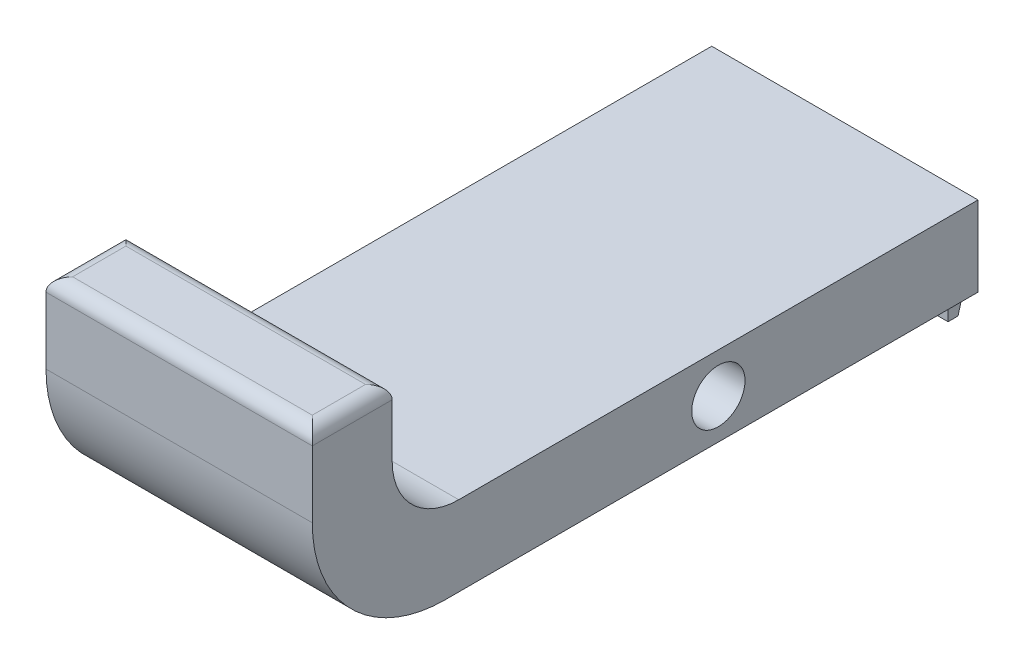
ISO-10303-21;
HEADER;
FILE_DESCRIPTION(('STEP AP214'),'2;1');
FILE_NAME('part.step','',(''),(''),'','','');
FILE_SCHEMA(('AUTOMOTIVE_DESIGN { 1 0 10303 214 1 1 1 1 }'));
ENDSEC;
DATA;
#1=APPLICATION_CONTEXT('core data for automotive mechanical design processes');
#2=APPLICATION_PROTOCOL_DEFINITION('international standard','automotive_design',2000,#1);
#3=PRODUCT_CONTEXT('',#1,'mechanical');
#4=PRODUCT('Part','Part','',(#3));
#5=PRODUCT_RELATED_PRODUCT_CATEGORY('part','',(#4));
#6=PRODUCT_DEFINITION_FORMATION('','',#4);
#7=PRODUCT_DEFINITION_CONTEXT('part definition',#1,'design');
#8=PRODUCT_DEFINITION('design','',#6,#7);
#9=PRODUCT_DEFINITION_SHAPE('','',#8);
#10=(LENGTH_UNIT() NAMED_UNIT(*) SI_UNIT(.MILLI.,.METRE.));
#11=(NAMED_UNIT(*) PLANE_ANGLE_UNIT() SI_UNIT($,.RADIAN.));
#12=(NAMED_UNIT(*) SI_UNIT($,.STERADIAN.) SOLID_ANGLE_UNIT());
#13=UNCERTAINTY_MEASURE_WITH_UNIT(LENGTH_MEASURE(1.E-05),#10,'distance_accuracy_value','');
#14=(GEOMETRIC_REPRESENTATION_CONTEXT(3) GLOBAL_UNCERTAINTY_ASSIGNED_CONTEXT((#13)) GLOBAL_UNIT_ASSIGNED_CONTEXT((#10,
#11,#12)) REPRESENTATION_CONTEXT('',''));
#15=CARTESIAN_POINT('',(0.,0.,0.));
#16=DIRECTION('',(0.,0.,1.));
#17=DIRECTION('',(1.,0.,0.));
#18=AXIS2_PLACEMENT_3D('',#15,#16,#17);
#19=CARTESIAN_POINT('',(-10.,-3.,50.));
#20=DIRECTION('',(0.,1.,0.));
#21=DIRECTION('',(0.,0.,1.));
#22=AXIS2_PLACEMENT_3D('',#19,#20,#21);
#23=PLANE('',#22);
#24=DIRECTION('',(0.,0.,-1.));
#25=VECTOR('',#24,1.);
#26=CARTESIAN_POINT('',(10.,-3.,50.));
#27=LINE('',#26,#25);
#28=CARTESIAN_POINT('',(10.,-3.,40.));
#29=VERTEX_POINT('',#28);
#30=CARTESIAN_POINT('',(10.,-3.,0.));
#31=VERTEX_POINT('',#30);
#32=EDGE_CURVE('E197',#29,#31,#27,.T.);
#33=ORIENTED_EDGE('',*,*,#32,.F.);
#34=DIRECTION('',(1.,0.,0.));
#35=VECTOR('',#34,1.);
#36=CARTESIAN_POINT('',(-10.,-3.,40.));
#37=LINE('',#36,#35);
#38=CARTESIAN_POINT('',(-10.,-3.,40.));
#39=VERTEX_POINT('',#38);
#40=EDGE_CURVE('E204',#29,#39,#37,.F.);
#41=ORIENTED_EDGE('',*,*,#40,.T.);
#42=DIRECTION('',(0.,0.,-1.));
#43=VECTOR('',#42,1.);
#44=CARTESIAN_POINT('',(-10.,-3.,50.));
#45=LINE('',#44,#43);
#46=CARTESIAN_POINT('',(-10.,-3.,0.));
#47=VERTEX_POINT('',#46);
#48=EDGE_CURVE('E180',#39,#47,#45,.T.);
#49=ORIENTED_EDGE('',*,*,#48,.T.);
#50=DIRECTION('',(1.,0.,0.));
#51=VECTOR('',#50,1.);
#52=CARTESIAN_POINT('',(-10.,-3.,0.));
#53=LINE('',#52,#51);
#54=CARTESIAN_POINT('',(-9.,-3.,0.));
#55=VERTEX_POINT('',#54);
#56=EDGE_CURVE('E181',#47,#55,#53,.T.);
#57=ORIENTED_EDGE('',*,*,#56,.T.);
#58=DIRECTION('',(0.,0.,1.));
#59=VECTOR('',#58,1.);
#60=CARTESIAN_POINT('',(-9.,-3.,1.25));
#61=LINE('',#60,#59);
#62=CARTESIAN_POINT('',(-9.,-3.,1.25));
#63=VERTEX_POINT('',#62);
#64=EDGE_CURVE('E165',#55,#63,#61,.T.);
#65=ORIENTED_EDGE('',*,*,#64,.T.);
#66=DIRECTION('',(1.,0.,0.));
#67=VECTOR('',#66,1.);
#68=CARTESIAN_POINT('',(-9.,-3.,1.25));
#69=LINE('',#68,#67);
#70=CARTESIAN_POINT('',(9.,-3.,1.25));
#71=VERTEX_POINT('',#70);
#72=EDGE_CURVE('E144',#63,#71,#69,.T.);
#73=ORIENTED_EDGE('',*,*,#72,.T.);
#74=DIRECTION('',(0.,0.,1.));
#75=VECTOR('',#74,1.);
#76=CARTESIAN_POINT('',(9.,-3.,1.25));
#77=LINE('',#76,#75);
#78=CARTESIAN_POINT('',(9.,-3.,0.));
#79=VERTEX_POINT('',#78);
#80=EDGE_CURVE('E151',#79,#71,#77,.T.);
#81=ORIENTED_EDGE('',*,*,#80,.F.);
#82=EDGE_CURVE('E184',#79,#31,#53,.T.);
#83=ORIENTED_EDGE('',*,*,#82,.T.);
#84=EDGE_LOOP('',(#33,#41,#49,#57,#65,#73,#81,#83));
#85=FACE_BOUND('',#84,.T.);
#86=ADVANCED_FACE('F37',(#85),#23,.F.);
#87=CARTESIAN_POINT('',(10.,3.,50.));
#88=DIRECTION('',(1.,0.,0.));
#89=DIRECTION('',(0.,0.,-1.));
#90=AXIS2_PLACEMENT_3D('',#87,#88,#89);
#91=PLANE('',#90);
#92=CARTESIAN_POINT('',(10.,0.,19.5));
#93=DIRECTION('',(1.,0.,0.));
#94=DIRECTION('',(0.,0.,-1.));
#95=AXIS2_PLACEMENT_3D('',#92,#93,#94);
#96=CIRCLE('',#95,2.);
#97=CARTESIAN_POINT('',(10.,0.,17.5));
#98=VERTEX_POINT('',#97);
#99=EDGE_CURVE('E250',#98,#98,#96,.T.);
#100=ORIENTED_EDGE('',*,*,#99,.F.);
#101=EDGE_LOOP('',(#100));
#102=FACE_BOUND('',#101,.T.);
#103=DIRECTION('',(0.,-1.,0.));
#104=VECTOR('',#103,1.);
#105=CARTESIAN_POINT('',(10.,13.,44.));
#106=LINE('',#105,#104);
#107=CARTESIAN_POINT('',(10.,12.,44.));
#108=VERTEX_POINT('',#107);
#109=CARTESIAN_POINT('',(10.,8.,44.));
#110=VERTEX_POINT('',#109);
#111=EDGE_CURVE('E247',#108,#110,#106,.T.);
#112=ORIENTED_EDGE('',*,*,#111,.F.);
#113=DIRECTION('',(0.,0.,-1.));
#114=VECTOR('',#113,1.);
#115=CARTESIAN_POINT('',(10.,12.,50.));
#116=LINE('',#115,#114);
#117=CARTESIAN_POINT('',(10.,12.,50.));
#118=VERTEX_POINT('',#117);
#119=EDGE_CURVE('E11',#108,#118,#116,.F.);
#120=ORIENTED_EDGE('',*,*,#119,.T.);
#121=DIRECTION('',(0.,-1.,0.));
#122=VECTOR('',#121,1.);
#123=CARTESIAN_POINT('',(10.,3.,50.));
#124=LINE('',#123,#122);
#125=CARTESIAN_POINT('',(10.,7.,50.));
#126=VERTEX_POINT('',#125);
#127=EDGE_CURVE('E175',#118,#126,#124,.T.);
#128=ORIENTED_EDGE('',*,*,#127,.T.);
#129=CARTESIAN_POINT('',(10.,7.,40.));
#130=DIRECTION('',(1.,0.,0.));
#131=DIRECTION('',(0.,0.,-1.));
#132=AXIS2_PLACEMENT_3D('',#129,#130,#131);
#133=CIRCLE('',#132,10.);
#134=EDGE_CURVE('E202',#126,#29,#133,.T.);
#135=ORIENTED_EDGE('',*,*,#134,.T.);
#136=ORIENTED_EDGE('',*,*,#32,.T.);
#137=DIRECTION('',(0.,-1.,0.));
#138=VECTOR('',#137,1.);
#139=CARTESIAN_POINT('',(10.,3.,0.));
#140=LINE('',#139,#138);
#141=CARTESIAN_POINT('',(10.,3.,0.));
#142=VERTEX_POINT('',#141);
#143=EDGE_CURVE('E183',#142,#31,#140,.T.);
#144=ORIENTED_EDGE('',*,*,#143,.F.);
#145=DIRECTION('',(0.,0.,-1.));
#146=VECTOR('',#145,1.);
#147=CARTESIAN_POINT('',(10.,3.,50.));
#148=LINE('',#147,#146);
#149=CARTESIAN_POINT('',(10.,3.,39.));
#150=VERTEX_POINT('',#149);
#151=EDGE_CURVE('E195',#150,#142,#148,.T.);
#152=ORIENTED_EDGE('',*,*,#151,.F.);
#153=CARTESIAN_POINT('',(10.,8.,39.));
#154=DIRECTION('',(1.,0.,0.));
#155=DIRECTION('',(0.,0.,-1.));
#156=AXIS2_PLACEMENT_3D('',#153,#154,#155);
#157=CIRCLE('',#156,5.);
#158=EDGE_CURVE('E216',#150,#110,#157,.F.);
#159=ORIENTED_EDGE('',*,*,#158,.T.);
#160=EDGE_LOOP('',(#112,#120,#128,#135,#136,#144,#152,#159));
#161=FACE_BOUND('',#160,.T.);
#162=ADVANCED_FACE('F289',(#102,#161),#91,.T.);
#163=CARTESIAN_POINT('',(-10.,3.,50.));
#164=DIRECTION('',(0.,1.,0.));
#165=DIRECTION('',(0.,0.,1.));
#166=AXIS2_PLACEMENT_3D('',#163,#164,#165);
#167=PLANE('',#166);
#168=DIRECTION('',(0.,0.,-1.));
#169=VECTOR('',#168,1.);
#170=CARTESIAN_POINT('',(-10.,3.,50.));
#171=LINE('',#170,#169);
#172=CARTESIAN_POINT('',(-10.,3.,39.));
#173=VERTEX_POINT('',#172);
#174=CARTESIAN_POINT('',(-10.,3.,0.));
#175=VERTEX_POINT('',#174);
#176=EDGE_CURVE('E193',#173,#175,#171,.T.);
#177=ORIENTED_EDGE('',*,*,#176,.F.);
#178=DIRECTION('',(-1.,0.,0.));
#179=VECTOR('',#178,1.);
#180=CARTESIAN_POINT('',(-10.,3.,39.));
#181=LINE('',#180,#179);
#182=EDGE_CURVE('E212',#173,#150,#181,.F.);
#183=ORIENTED_EDGE('',*,*,#182,.T.);
#184=ORIENTED_EDGE('',*,*,#151,.T.);
#185=DIRECTION('',(1.,0.,0.));
#186=VECTOR('',#185,1.);
#187=CARTESIAN_POINT('',(-10.,3.,0.));
#188=LINE('',#187,#186);
#189=EDGE_CURVE('E187',#175,#142,#188,.T.);
#190=ORIENTED_EDGE('',*,*,#189,.F.);
#191=EDGE_LOOP('',(#177,#183,#184,#190));
#192=FACE_BOUND('',#191,.T.);
#193=ADVANCED_FACE('F283',(#192),#167,.T.);
#194=CARTESIAN_POINT('',(-10.,3.,50.));
#195=DIRECTION('',(1.,0.,0.));
#196=DIRECTION('',(0.,0.,-1.));
#197=AXIS2_PLACEMENT_3D('',#194,#195,#196);
#198=PLANE('',#197);
#199=CARTESIAN_POINT('',(-10.,0.,19.5));
#200=DIRECTION('',(1.,0.,0.));
#201=DIRECTION('',(0.,0.,-1.));
#202=AXIS2_PLACEMENT_3D('',#199,#200,#201);
#203=CIRCLE('',#202,2.);
#204=CARTESIAN_POINT('',(-10.,0.,17.5));
#205=VERTEX_POINT('',#204);
#206=EDGE_CURVE('E161',#205,#205,#203,.F.);
#207=ORIENTED_EDGE('',*,*,#206,.F.);
#208=EDGE_LOOP('',(#207));
#209=FACE_BOUND('',#208,.T.);
#210=DIRECTION('',(0.,-1.,0.));
#211=VECTOR('',#210,1.);
#212=CARTESIAN_POINT('',(-10.,3.,50.));
#213=LINE('',#212,#211);
#214=CARTESIAN_POINT('',(-10.,12.,50.));
#215=VERTEX_POINT('',#214);
#216=CARTESIAN_POINT('',(-10.,7.,50.));
#217=VERTEX_POINT('',#216);
#218=EDGE_CURVE('E177',#215,#217,#213,.T.);
#219=ORIENTED_EDGE('',*,*,#218,.F.);
#220=DIRECTION('',(0.,0.,1.));
#221=VECTOR('',#220,1.);
#222=CARTESIAN_POINT('',(-10.,12.,50.));
#223=LINE('',#222,#221);
#224=CARTESIAN_POINT('',(-10.,12.,44.));
#225=VERTEX_POINT('',#224);
#226=EDGE_CURVE('E61',#215,#225,#223,.F.);
#227=ORIENTED_EDGE('',*,*,#226,.T.);
#228=DIRECTION('',(0.,-1.,0.));
#229=VECTOR('',#228,1.);
#230=CARTESIAN_POINT('',(-10.,13.,44.));
#231=LINE('',#230,#229);
#232=CARTESIAN_POINT('',(-10.,8.,44.));
#233=VERTEX_POINT('',#232);
#234=EDGE_CURVE('E243',#225,#233,#231,.T.);
#235=ORIENTED_EDGE('',*,*,#234,.T.);
#236=CARTESIAN_POINT('',(-10.,8.,39.));
#237=DIRECTION('',(1.,0.,0.));
#238=DIRECTION('',(0.,0.,-1.));
#239=AXIS2_PLACEMENT_3D('',#236,#237,#238);
#240=CIRCLE('',#239,5.);
#241=EDGE_CURVE('E214',#233,#173,#240,.T.);
#242=ORIENTED_EDGE('',*,*,#241,.T.);
#243=ORIENTED_EDGE('',*,*,#176,.T.);
#244=DIRECTION('',(0.,-1.,0.));
#245=VECTOR('',#244,1.);
#246=CARTESIAN_POINT('',(-10.,3.,0.));
#247=LINE('',#246,#245);
#248=EDGE_CURVE('E178',#175,#47,#247,.T.);
#249=ORIENTED_EDGE('',*,*,#248,.T.);
#250=ORIENTED_EDGE('',*,*,#48,.F.);
#251=CARTESIAN_POINT('',(-10.,7.,40.));
#252=DIRECTION('',(1.,0.,0.));
#253=DIRECTION('',(0.,0.,-1.));
#254=AXIS2_PLACEMENT_3D('',#251,#252,#253);
#255=CIRCLE('',#254,10.);
#256=EDGE_CURVE('E206',#39,#217,#255,.F.);
#257=ORIENTED_EDGE('',*,*,#256,.T.);
#258=EDGE_LOOP('',(#219,#227,#235,#242,#243,#249,#250,#257));
#259=FACE_BOUND('',#258,.T.);
#260=ADVANCED_FACE('F279',(#209,#259),#198,.F.);
#261=CARTESIAN_POINT('',(0.,0.,50.));
#262=DIRECTION('',(0.,0.,-1.));
#263=DIRECTION('',(-1.,0.,0.));
#264=AXIS2_PLACEMENT_3D('',#261,#262,#263);
#265=PLANE('',#264);
#266=ORIENTED_EDGE('',*,*,#127,.F.);
#267=DIRECTION('',(1.,0.,0.));
#268=VECTOR('',#267,1.);
#269=CARTESIAN_POINT('',(0.,12.,50.));
#270=LINE('',#269,#268);
#271=EDGE_CURVE('E228',#118,#215,#270,.F.);
#272=ORIENTED_EDGE('',*,*,#271,.T.);
#273=ORIENTED_EDGE('',*,*,#218,.T.);
#274=DIRECTION('',(1.,0.,0.));
#275=VECTOR('',#274,1.);
#276=CARTESIAN_POINT('',(0.,7.,50.));
#277=LINE('',#276,#275);
#278=EDGE_CURVE('E199',#217,#126,#277,.T.);
#279=ORIENTED_EDGE('',*,*,#278,.T.);
#280=EDGE_LOOP('',(#266,#272,#273,#279));
#281=FACE_BOUND('',#280,.T.);
#282=ADVANCED_FACE('F296',(#281),#265,.F.);
#283=CARTESIAN_POINT('',(0.,0.,0.));
#284=DIRECTION('',(0.,0.,-1.));
#285=DIRECTION('',(-1.,0.,0.));
#286=AXIS2_PLACEMENT_3D('',#283,#284,#285);
#287=PLANE('',#286);
#288=ORIENTED_EDGE('',*,*,#56,.F.);
#289=ORIENTED_EDGE('',*,*,#248,.F.);
#290=ORIENTED_EDGE('',*,*,#189,.T.);
#291=ORIENTED_EDGE('',*,*,#143,.T.);
#292=ORIENTED_EDGE('',*,*,#82,.F.);
#293=DIRECTION('',(1.,0.,0.));
#294=VECTOR('',#293,1.);
#295=CARTESIAN_POINT('',(-9.,-3.,0.));
#296=LINE('',#295,#294);
#297=EDGE_CURVE('E264',#55,#79,#296,.T.);
#298=ORIENTED_EDGE('',*,*,#297,.F.);
#299=EDGE_LOOP('',(#288,#289,#290,#291,#292,#298));
#300=FACE_BOUND('',#299,.T.);
#301=ADVANCED_FACE('F274',(#300),#287,.T.);
#302=CARTESIAN_POINT('',(-9.,-3.,0.));
#303=DIRECTION('',(0.,-0.267643863786095,-0.963517909629941));
#304=DIRECTION('',(0.,0.963517909629941,-0.267643863786095));
#305=AXIS2_PLACEMENT_3D('',#302,#303,#304);
#306=PLANE('',#305);
#307=ORIENTED_EDGE('',*,*,#297,.T.);
#308=DIRECTION('',(0.,0.96351790962994,-0.267643863786095));
#309=VECTOR('',#308,1.);
#310=CARTESIAN_POINT('',(9.,-3.,0.));
#311=LINE('',#310,#309);
#312=CARTESIAN_POINT('',(9.,-4.8,0.5));
#313=VERTEX_POINT('',#312);
#314=EDGE_CURVE('E157',#313,#79,#311,.T.);
#315=ORIENTED_EDGE('',*,*,#314,.F.);
#316=DIRECTION('',(1.,0.,0.));
#317=VECTOR('',#316,1.);
#318=CARTESIAN_POINT('',(-9.,-4.8,0.5));
#319=LINE('',#318,#317);
#320=CARTESIAN_POINT('',(-9.,-4.8,0.5));
#321=VERTEX_POINT('',#320);
#322=EDGE_CURVE('E168',#321,#313,#319,.T.);
#323=ORIENTED_EDGE('',*,*,#322,.F.);
#324=DIRECTION('',(0.,0.96351790962994,-0.267643863786095));
#325=VECTOR('',#324,1.);
#326=CARTESIAN_POINT('',(-9.,-3.,0.));
#327=LINE('',#326,#325);
#328=EDGE_CURVE('E166',#321,#55,#327,.T.);
#329=ORIENTED_EDGE('',*,*,#328,.T.);
#330=EDGE_LOOP('',(#307,#315,#323,#329));
#331=FACE_BOUND('',#330,.T.);
#332=ADVANCED_FACE('F270',(#331),#306,.T.);
#333=CARTESIAN_POINT('',(-9.,-4.8,0.5));
#334=DIRECTION('',(0.,-1.,0.));
#335=DIRECTION('',(0.,0.,-1.));
#336=AXIS2_PLACEMENT_3D('',#333,#334,#335);
#337=PLANE('',#336);
#338=ORIENTED_EDGE('',*,*,#322,.T.);
#339=DIRECTION('',(0.,0.,-1.));
#340=VECTOR('',#339,1.);
#341=CARTESIAN_POINT('',(9.,-4.8,0.5));
#342=LINE('',#341,#340);
#343=CARTESIAN_POINT('',(9.,-4.8,1.25));
#344=VERTEX_POINT('',#343);
#345=EDGE_CURVE('E150',#344,#313,#342,.T.);
#346=ORIENTED_EDGE('',*,*,#345,.F.);
#347=DIRECTION('',(1.,0.,0.));
#348=VECTOR('',#347,1.);
#349=CARTESIAN_POINT('',(-9.,-4.8,1.25));
#350=LINE('',#349,#348);
#351=CARTESIAN_POINT('',(-9.,-4.8,1.25));
#352=VERTEX_POINT('',#351);
#353=EDGE_CURVE('E146',#352,#344,#350,.T.);
#354=ORIENTED_EDGE('',*,*,#353,.F.);
#355=DIRECTION('',(0.,0.,-1.));
#356=VECTOR('',#355,1.);
#357=CARTESIAN_POINT('',(-9.,-4.8,0.5));
#358=LINE('',#357,#356);
#359=EDGE_CURVE('E171',#352,#321,#358,.T.);
#360=ORIENTED_EDGE('',*,*,#359,.T.);
#361=EDGE_LOOP('',(#338,#346,#354,#360));
#362=FACE_BOUND('',#361,.T.);
#363=ADVANCED_FACE('F266',(#362),#337,.T.);
#364=CARTESIAN_POINT('',(-9.,-4.8,1.25));
#365=DIRECTION('',(0.,0.,1.));
#366=DIRECTION('',(1.,0.,0.));
#367=AXIS2_PLACEMENT_3D('',#364,#365,#366);
#368=PLANE('',#367);
#369=ORIENTED_EDGE('',*,*,#353,.T.);
#370=DIRECTION('',(0.,-1.,0.));
#371=VECTOR('',#370,1.);
#372=CARTESIAN_POINT('',(9.,-4.8,1.25));
#373=LINE('',#372,#371);
#374=EDGE_CURVE('E139',#71,#344,#373,.T.);
#375=ORIENTED_EDGE('',*,*,#374,.F.);
#376=ORIENTED_EDGE('',*,*,#72,.F.);
#377=DIRECTION('',(0.,-1.,0.));
#378=VECTOR('',#377,1.);
#379=CARTESIAN_POINT('',(-9.,-4.8,1.25));
#380=LINE('',#379,#378);
#381=EDGE_CURVE('E260',#63,#352,#380,.T.);
#382=ORIENTED_EDGE('',*,*,#381,.T.);
#383=EDGE_LOOP('',(#369,#375,#376,#382));
#384=FACE_BOUND('',#383,.T.);
#385=ADVANCED_FACE('F141',(#384),#368,.T.);
#386=CARTESIAN_POINT('',(-9.,0.,0.));
#387=DIRECTION('',(1.,0.,0.));
#388=DIRECTION('',(0.,0.,-1.));
#389=AXIS2_PLACEMENT_3D('',#386,#387,#388);
#390=PLANE('',#389);
#391=ORIENTED_EDGE('',*,*,#64,.F.);
#392=ORIENTED_EDGE('',*,*,#328,.F.);
#393=ORIENTED_EDGE('',*,*,#359,.F.);
#394=ORIENTED_EDGE('',*,*,#381,.F.);
#395=EDGE_LOOP('',(#391,#392,#393,#394));
#396=FACE_BOUND('',#395,.T.);
#397=ADVANCED_FACE('F435',(#396),#390,.F.);
#398=CARTESIAN_POINT('',(9.,0.,0.));
#399=DIRECTION('',(1.,0.,0.));
#400=DIRECTION('',(0.,0.,-1.));
#401=AXIS2_PLACEMENT_3D('',#398,#399,#400);
#402=PLANE('',#401);
#403=ORIENTED_EDGE('',*,*,#80,.T.);
#404=ORIENTED_EDGE('',*,*,#374,.T.);
#405=ORIENTED_EDGE('',*,*,#345,.T.);
#406=ORIENTED_EDGE('',*,*,#314,.T.);
#407=EDGE_LOOP('',(#403,#404,#405,#406));
#408=FACE_BOUND('',#407,.T.);
#409=ADVANCED_FACE('F155',(#408),#402,.T.);
#410=CARTESIAN_POINT('',(-15.6568542494924,0.,19.5));
#411=DIRECTION('',(1.,0.,0.));
#412=DIRECTION('',(0.,0.,-1.));
#413=AXIS2_PLACEMENT_3D('',#410,#411,#412);
#414=CYLINDRICAL_SURFACE('',#413,2.);
#415=ORIENTED_EDGE('',*,*,#206,.T.);
#416=EDGE_LOOP('',(#415));
#417=FACE_BOUND('',#416,.T.);
#418=ORIENTED_EDGE('',*,*,#99,.T.);
#419=EDGE_LOOP('',(#418));
#420=FACE_BOUND('',#419,.T.);
#421=ADVANCED_FACE('F367',(#417,#420),#414,.F.);
#422=CARTESIAN_POINT('',(-10.,13.,44.));
#423=DIRECTION('',(0.,0.,1.));
#424=DIRECTION('',(1.,0.,0.));
#425=AXIS2_PLACEMENT_3D('',#422,#423,#424);
#426=PLANE('',#425);
#427=ORIENTED_EDGE('',*,*,#234,.F.);
#428=DIRECTION('',(-1.,0.,0.));
#429=VECTOR('',#428,1.);
#430=CARTESIAN_POINT('',(-10.,12.,44.));
#431=LINE('',#430,#429);
#432=EDGE_CURVE('E46',#225,#108,#431,.F.);
#433=ORIENTED_EDGE('',*,*,#432,.T.);
#434=ORIENTED_EDGE('',*,*,#111,.T.);
#435=DIRECTION('',(-1.,0.,0.));
#436=VECTOR('',#435,1.);
#437=CARTESIAN_POINT('',(-10.,8.,44.));
#438=LINE('',#437,#436);
#439=EDGE_CURVE('E209',#110,#233,#438,.T.);
#440=ORIENTED_EDGE('',*,*,#439,.T.);
#441=EDGE_LOOP('',(#427,#433,#434,#440));
#442=FACE_BOUND('',#441,.T.);
#443=ADVANCED_FACE('F357',(#442),#426,.F.);
#444=CARTESIAN_POINT('',(0.,13.,0.));
#445=DIRECTION('',(0.,-1.,0.));
#446=DIRECTION('',(0.,0.,-1.));
#447=AXIS2_PLACEMENT_3D('',#444,#445,#446);
#448=PLANE('',#447);
#449=DIRECTION('',(0.,0.,1.));
#450=VECTOR('',#449,1.);
#451=CARTESIAN_POINT('',(-9.,13.,0.));
#452=LINE('',#451,#450);
#453=CARTESIAN_POINT('',(-9.,13.,45.));
#454=VERTEX_POINT('',#453);
#455=CARTESIAN_POINT('',(-9.,13.,49.));
#456=VERTEX_POINT('',#455);
#457=EDGE_CURVE('E223',#454,#456,#452,.T.);
#458=ORIENTED_EDGE('',*,*,#457,.T.);
#459=DIRECTION('',(1.,0.,0.));
#460=VECTOR('',#459,1.);
#461=CARTESIAN_POINT('',(0.,13.,49.));
#462=LINE('',#461,#460);
#463=CARTESIAN_POINT('',(9.00000000000001,13.,49.));
#464=VERTEX_POINT('',#463);
#465=EDGE_CURVE('E225',#456,#464,#462,.T.);
#466=ORIENTED_EDGE('',*,*,#465,.T.);
#467=DIRECTION('',(0.,0.,-1.));
#468=VECTOR('',#467,1.);
#469=CARTESIAN_POINT('',(9.00000000000001,13.,44.));
#470=LINE('',#469,#468);
#471=CARTESIAN_POINT('',(9.00000000000001,13.,45.));
#472=VERTEX_POINT('',#471);
#473=EDGE_CURVE('E219',#464,#472,#470,.T.);
#474=ORIENTED_EDGE('',*,*,#473,.T.);
#475=DIRECTION('',(-1.,0.,0.));
#476=VECTOR('',#475,1.);
#477=CARTESIAN_POINT('',(0.,13.,45.));
#478=LINE('',#477,#476);
#479=EDGE_CURVE('E221',#472,#454,#478,.T.);
#480=ORIENTED_EDGE('',*,*,#479,.T.);
#481=EDGE_LOOP('',(#458,#466,#474,#480));
#482=FACE_BOUND('',#481,.T.);
#483=ADVANCED_FACE('F306',(#482),#448,.F.);
#484=CARTESIAN_POINT('',(0.,7.,40.));
#485=DIRECTION('',(1.,0.,0.));
#486=DIRECTION('',(0.,0.,-1.));
#487=AXIS2_PLACEMENT_3D('',#484,#485,#486);
#488=CYLINDRICAL_SURFACE('',#487,10.);
#489=ORIENTED_EDGE('',*,*,#256,.F.);
#490=ORIENTED_EDGE('',*,*,#40,.F.);
#491=ORIENTED_EDGE('',*,*,#134,.F.);
#492=ORIENTED_EDGE('',*,*,#278,.F.);
#493=EDGE_LOOP('',(#489,#490,#491,#492));
#494=FACE_BOUND('',#493,.T.);
#495=ADVANCED_FACE('F292',(#494),#488,.T.);
#496=CARTESIAN_POINT('',(-10.,8.,39.));
#497=DIRECTION('',(-1.,0.,0.));
#498=DIRECTION('',(0.,0.,1.));
#499=AXIS2_PLACEMENT_3D('',#496,#497,#498);
#500=CYLINDRICAL_SURFACE('',#499,5.);
#501=ORIENTED_EDGE('',*,*,#158,.F.);
#502=ORIENTED_EDGE('',*,*,#182,.F.);
#503=ORIENTED_EDGE('',*,*,#241,.F.);
#504=ORIENTED_EDGE('',*,*,#439,.F.);
#505=EDGE_LOOP('',(#501,#502,#503,#504));
#506=FACE_BOUND('',#505,.T.);
#507=ADVANCED_FACE('F314',(#506),#500,.F.);
#508=CARTESIAN_POINT('',(0.,12.,45.));
#509=DIRECTION('',(-1.,0.,0.));
#510=DIRECTION('',(0.,0.,1.));
#511=AXIS2_PLACEMENT_3D('',#508,#509,#510);
#512=CYLINDRICAL_SURFACE('',#511,1.);
#513=CARTESIAN_POINT('',(9.00000000000001,12.,45.));
#514=DIRECTION('',(0.707106781186547,0.,0.707106781186547));
#515=DIRECTION('',(-0.707106781186547,0.,0.707106781186547));
#516=AXIS2_PLACEMENT_3D('',#513,#514,#515);
#517=ELLIPSE('',#516,1.41421356237309,1.);
#518=EDGE_CURVE('E236',#108,#472,#517,.T.);
#519=ORIENTED_EDGE('',*,*,#518,.F.);
#520=ORIENTED_EDGE('',*,*,#432,.F.);
#521=CARTESIAN_POINT('',(-9.,12.,45.));
#522=DIRECTION('',(-0.707106781186547,0.,0.707106781186547));
#523=DIRECTION('',(-0.707106781186547,0.,-0.707106781186547));
#524=AXIS2_PLACEMENT_3D('',#521,#522,#523);
#525=ELLIPSE('',#524,1.41421356237309,1.);
#526=EDGE_CURVE('E41',#454,#225,#525,.T.);
#527=ORIENTED_EDGE('',*,*,#526,.F.);
#528=ORIENTED_EDGE('',*,*,#479,.F.);
#529=EDGE_LOOP('',(#519,#520,#527,#528));
#530=FACE_BOUND('',#529,.T.);
#531=ADVANCED_FACE('F39',(#530),#512,.T.);
#532=CARTESIAN_POINT('',(-9.,12.,0.));
#533=DIRECTION('',(0.,0.,1.));
#534=DIRECTION('',(1.,0.,0.));
#535=AXIS2_PLACEMENT_3D('',#532,#533,#534);
#536=CYLINDRICAL_SURFACE('',#535,1.);
#537=ORIENTED_EDGE('',*,*,#526,.T.);
#538=ORIENTED_EDGE('',*,*,#226,.F.);
#539=CARTESIAN_POINT('',(-9.,12.,49.));
#540=DIRECTION('',(0.707106781186547,0.,0.707106781186547));
#541=DIRECTION('',(-0.707106781186547,0.,0.707106781186547));
#542=AXIS2_PLACEMENT_3D('',#539,#540,#541);
#543=ELLIPSE('',#542,1.41421356237309,1.);
#544=EDGE_CURVE('E235',#456,#215,#543,.T.);
#545=ORIENTED_EDGE('',*,*,#544,.F.);
#546=ORIENTED_EDGE('',*,*,#457,.F.);
#547=EDGE_LOOP('',(#537,#538,#545,#546));
#548=FACE_BOUND('',#547,.T.);
#549=ADVANCED_FACE('F307',(#548),#536,.T.);
#550=CARTESIAN_POINT('',(9.00000000000001,12.,0.));
#551=DIRECTION('',(0.,0.,1.));
#552=DIRECTION('',(1.,0.,0.));
#553=AXIS2_PLACEMENT_3D('',#550,#551,#552);
#554=CYLINDRICAL_SURFACE('',#553,1.);
#555=ORIENTED_EDGE('',*,*,#518,.T.);
#556=ORIENTED_EDGE('',*,*,#473,.F.);
#557=CARTESIAN_POINT('',(9.00000000000001,12.,49.));
#558=DIRECTION('',(-0.707106781186547,0.,0.707106781186547));
#559=DIRECTION('',(0.707106781186547,0.,0.707106781186547));
#560=AXIS2_PLACEMENT_3D('',#557,#558,#559);
#561=ELLIPSE('',#560,1.41421356237309,1.);
#562=EDGE_CURVE('E233',#118,#464,#561,.T.);
#563=ORIENTED_EDGE('',*,*,#562,.F.);
#564=ORIENTED_EDGE('',*,*,#119,.F.);
#565=EDGE_LOOP('',(#555,#556,#563,#564));
#566=FACE_BOUND('',#565,.T.);
#567=ADVANCED_FACE('F303',(#566),#554,.T.);
#568=CARTESIAN_POINT('',(0.,12.,49.));
#569=DIRECTION('',(1.,0.,0.));
#570=DIRECTION('',(0.,0.,-1.));
#571=AXIS2_PLACEMENT_3D('',#568,#569,#570);
#572=CYLINDRICAL_SURFACE('',#571,1.);
#573=ORIENTED_EDGE('',*,*,#544,.T.);
#574=ORIENTED_EDGE('',*,*,#271,.F.);
#575=ORIENTED_EDGE('',*,*,#562,.T.);
#576=ORIENTED_EDGE('',*,*,#465,.F.);
#577=EDGE_LOOP('',(#573,#574,#575,#576));
#578=FACE_BOUND('',#577,.T.);
#579=ADVANCED_FACE('F300',(#578),#572,.T.);
#580=CLOSED_SHELL('',(#86,#162,#193,#260,#282,#301,#332,#363,#385,#397,#409,#421,#443,#483,#495,
#507,#531,#549,#567,#579));
#581=MANIFOLD_SOLID_BREP('B2',#580);
#582=ADVANCED_BREP_SHAPE_REPRESENTATION('',(#18,#581),#14);
#583=SHAPE_DEFINITION_REPRESENTATION(#9,#582);
ENDSEC;
END-ISO-10303-21;
